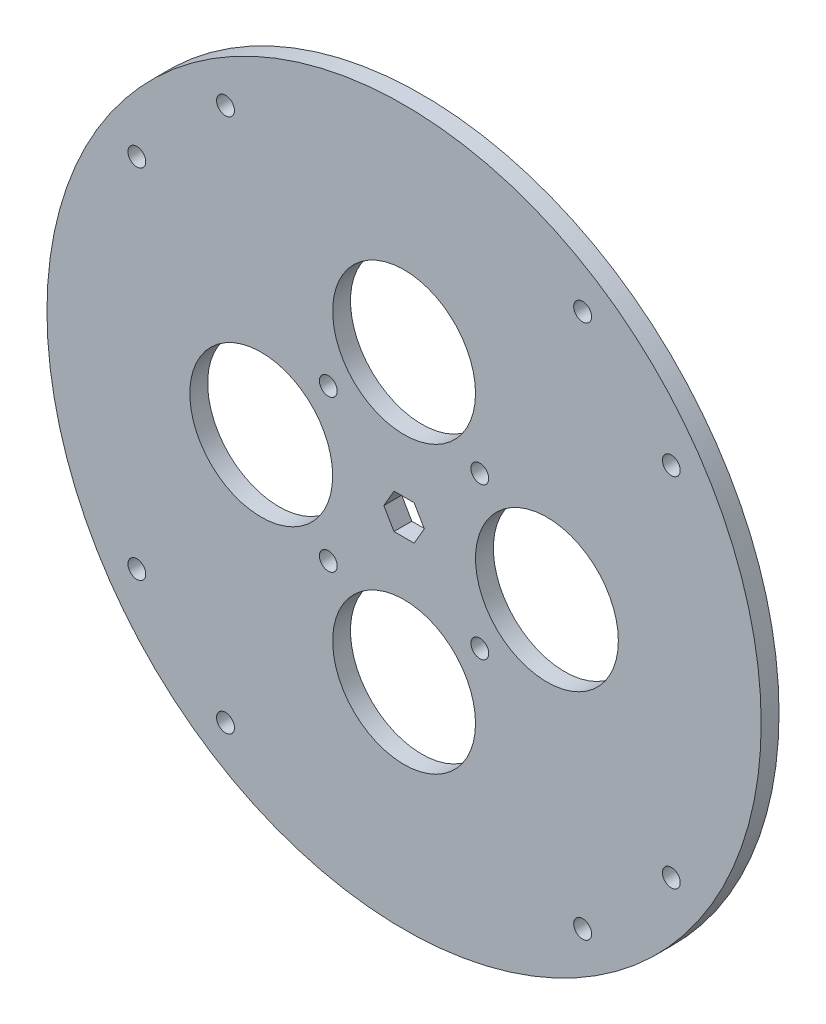
ISO-10303-21;
HEADER;
FILE_DESCRIPTION(('STEP AP214'),'2;1');
FILE_NAME('part.step','',(''),(''),'','','');
FILE_SCHEMA(('AUTOMOTIVE_DESIGN { 1 0 10303 214 1 1 1 1 }'));
ENDSEC;
DATA;
#1=APPLICATION_CONTEXT('core data for automotive mechanical design processes');
#2=APPLICATION_PROTOCOL_DEFINITION('international standard','automotive_design',2000,#1);
#3=PRODUCT_CONTEXT('',#1,'mechanical');
#4=PRODUCT('Part','Part','',(#3));
#5=PRODUCT_RELATED_PRODUCT_CATEGORY('part','',(#4));
#6=PRODUCT_DEFINITION_FORMATION('','',#4);
#7=PRODUCT_DEFINITION_CONTEXT('part definition',#1,'design');
#8=PRODUCT_DEFINITION('design','',#6,#7);
#9=PRODUCT_DEFINITION_SHAPE('','',#8);
#10=(LENGTH_UNIT() NAMED_UNIT(*) SI_UNIT(.MILLI.,.METRE.));
#11=(NAMED_UNIT(*) PLANE_ANGLE_UNIT() SI_UNIT($,.RADIAN.));
#12=(NAMED_UNIT(*) SI_UNIT($,.STERADIAN.) SOLID_ANGLE_UNIT());
#13=UNCERTAINTY_MEASURE_WITH_UNIT(LENGTH_MEASURE(1.E-05),#10,'distance_accuracy_value','');
#14=(GEOMETRIC_REPRESENTATION_CONTEXT(3) GLOBAL_UNCERTAINTY_ASSIGNED_CONTEXT((#13)) GLOBAL_UNIT_ASSIGNED_CONTEXT((#10,
#11,#12)) REPRESENTATION_CONTEXT('',''));
#15=CARTESIAN_POINT('',(0.,0.,0.));
#16=DIRECTION('',(0.,0.,1.));
#17=DIRECTION('',(1.,0.,0.));
#18=AXIS2_PLACEMENT_3D('',#15,#16,#17);
#19=CARTESIAN_POINT('',(0.,0.,6.35));
#20=DIRECTION('',(0.,0.,1.));
#21=DIRECTION('',(1.,0.,0.));
#22=AXIS2_PLACEMENT_3D('',#19,#20,#21);
#23=PLANE('',#22);
#24=CARTESIAN_POINT('',(63.5,95.0380976240581,6.35));
#25=DIRECTION('',(0.,0.,-1.));
#26=DIRECTION('',(-1.,0.,0.));
#27=AXIS2_PLACEMENT_3D('',#24,#25,#26);
#28=CIRCLE('',#27,3.175);
#29=CARTESIAN_POINT('',(60.325,95.0380976240581,6.35));
#30=VERTEX_POINT('',#29);
#31=EDGE_CURVE('E196',#30,#30,#28,.T.);
#32=ORIENTED_EDGE('',*,*,#31,.T.);
#33=EDGE_LOOP('',(#32));
#34=FACE_BOUND('',#33,.T.);
#35=CARTESIAN_POINT('',(-95.0380976240581,-63.5,6.35));
#36=DIRECTION('',(0.,0.,-1.));
#37=DIRECTION('',(-1.,0.,0.));
#38=AXIS2_PLACEMENT_3D('',#35,#36,#37);
#39=CIRCLE('',#38,3.175);
#40=CARTESIAN_POINT('',(-98.2130976240581,-63.5,6.35));
#41=VERTEX_POINT('',#40);
#42=EDGE_CURVE('E200',#41,#41,#39,.T.);
#43=ORIENTED_EDGE('',*,*,#42,.T.);
#44=EDGE_LOOP('',(#43));
#45=FACE_BOUND('',#44,.T.);
#46=CARTESIAN_POINT('',(-95.0380976240581,63.5,6.35));
#47=DIRECTION('',(0.,0.,-1.));
#48=DIRECTION('',(-1.,0.,0.));
#49=AXIS2_PLACEMENT_3D('',#46,#47,#48);
#50=CIRCLE('',#49,3.175);
#51=CARTESIAN_POINT('',(-98.2130976240581,63.5,6.35));
#52=VERTEX_POINT('',#51);
#53=EDGE_CURVE('E204',#52,#52,#50,.T.);
#54=ORIENTED_EDGE('',*,*,#53,.T.);
#55=EDGE_LOOP('',(#54));
#56=FACE_BOUND('',#55,.T.);
#57=CARTESIAN_POINT('',(63.5,-95.0380976240581,6.35));
#58=DIRECTION('',(0.,0.,-1.));
#59=DIRECTION('',(-1.,0.,0.));
#60=AXIS2_PLACEMENT_3D('',#57,#58,#59);
#61=CIRCLE('',#60,3.175);
#62=CARTESIAN_POINT('',(60.325,-95.0380976240581,6.35));
#63=VERTEX_POINT('',#62);
#64=EDGE_CURVE('E208',#63,#63,#61,.T.);
#65=ORIENTED_EDGE('',*,*,#64,.T.);
#66=EDGE_LOOP('',(#65));
#67=FACE_BOUND('',#66,.T.);
#68=CARTESIAN_POINT('',(-26.9407683632075,26.9407683632075,6.35));
#69=DIRECTION('',(0.,0.,-1.));
#70=DIRECTION('',(-1.,0.,0.));
#71=AXIS2_PLACEMENT_3D('',#68,#69,#70);
#72=CIRCLE('',#71,3.175);
#73=CARTESIAN_POINT('',(-30.1157683632075,26.9407683632075,6.35));
#74=VERTEX_POINT('',#73);
#75=EDGE_CURVE('E212',#74,#74,#72,.T.);
#76=ORIENTED_EDGE('',*,*,#75,.T.);
#77=EDGE_LOOP('',(#76));
#78=FACE_BOUND('',#77,.T.);
#79=CARTESIAN_POINT('',(-26.9407683632075,-26.9407683632075,6.35));
#80=DIRECTION('',(0.,0.,-1.));
#81=DIRECTION('',(-1.,0.,0.));
#82=AXIS2_PLACEMENT_3D('',#79,#80,#81);
#83=CIRCLE('',#82,3.175);
#84=CARTESIAN_POINT('',(-30.1157683632075,-26.9407683632075,6.35));
#85=VERTEX_POINT('',#84);
#86=EDGE_CURVE('E216',#85,#85,#83,.T.);
#87=ORIENTED_EDGE('',*,*,#86,.T.);
#88=EDGE_LOOP('',(#87));
#89=FACE_BOUND('',#88,.T.);
#90=CARTESIAN_POINT('',(26.9407683632075,-26.9407683632075,6.35));
#91=DIRECTION('',(0.,0.,-1.));
#92=DIRECTION('',(-1.,0.,0.));
#93=AXIS2_PLACEMENT_3D('',#90,#91,#92);
#94=CIRCLE('',#93,3.175);
#95=CARTESIAN_POINT('',(23.7657683632075,-26.9407683632075,6.35));
#96=VERTEX_POINT('',#95);
#97=EDGE_CURVE('E220',#96,#96,#94,.T.);
#98=ORIENTED_EDGE('',*,*,#97,.T.);
#99=EDGE_LOOP('',(#98));
#100=FACE_BOUND('',#99,.T.);
#101=CARTESIAN_POINT('',(-63.5,95.0380976240581,6.35));
#102=DIRECTION('',(0.,0.,-1.));
#103=DIRECTION('',(-1.,0.,0.));
#104=AXIS2_PLACEMENT_3D('',#101,#102,#103);
#105=CIRCLE('',#104,3.175);
#106=CARTESIAN_POINT('',(-66.675,95.0380976240581,6.35));
#107=VERTEX_POINT('',#106);
#108=EDGE_CURVE('E224',#107,#107,#105,.T.);
#109=ORIENTED_EDGE('',*,*,#108,.T.);
#110=EDGE_LOOP('',(#109));
#111=FACE_BOUND('',#110,.T.);
#112=CARTESIAN_POINT('',(95.0380976240581,-63.5,6.35));
#113=DIRECTION('',(0.,0.,-1.));
#114=DIRECTION('',(-1.,0.,0.));
#115=AXIS2_PLACEMENT_3D('',#112,#113,#114);
#116=CIRCLE('',#115,3.175);
#117=CARTESIAN_POINT('',(91.8630976240581,-63.5,6.35));
#118=VERTEX_POINT('',#117);
#119=EDGE_CURVE('E228',#118,#118,#116,.T.);
#120=ORIENTED_EDGE('',*,*,#119,.T.);
#121=EDGE_LOOP('',(#120));
#122=FACE_BOUND('',#121,.T.);
#123=CARTESIAN_POINT('',(95.0380976240581,63.5,6.35));
#124=DIRECTION('',(0.,0.,-1.));
#125=DIRECTION('',(-1.,0.,0.));
#126=AXIS2_PLACEMENT_3D('',#123,#124,#125);
#127=CIRCLE('',#126,3.17499999999997);
#128=CARTESIAN_POINT('',(91.8630976240582,63.5,6.35));
#129=VERTEX_POINT('',#128);
#130=EDGE_CURVE('E232',#129,#129,#127,.T.);
#131=ORIENTED_EDGE('',*,*,#130,.T.);
#132=EDGE_LOOP('',(#131));
#133=FACE_BOUND('',#132,.T.);
#134=CARTESIAN_POINT('',(-63.5,-95.0380976240581,6.35));
#135=DIRECTION('',(0.,0.,-1.));
#136=DIRECTION('',(-1.,0.,0.));
#137=AXIS2_PLACEMENT_3D('',#134,#135,#136);
#138=CIRCLE('',#137,3.175);
#139=CARTESIAN_POINT('',(-66.675,-95.0380976240581,6.35));
#140=VERTEX_POINT('',#139);
#141=EDGE_CURVE('E236',#140,#140,#138,.T.);
#142=ORIENTED_EDGE('',*,*,#141,.T.);
#143=EDGE_LOOP('',(#142));
#144=FACE_BOUND('',#143,.T.);
#145=CARTESIAN_POINT('',(26.9407683632075,26.9407683632075,6.35));
#146=DIRECTION('',(0.,0.,-1.));
#147=DIRECTION('',(-1.,0.,0.));
#148=AXIS2_PLACEMENT_3D('',#145,#146,#147);
#149=CIRCLE('',#148,3.175);
#150=CARTESIAN_POINT('',(23.7657683632075,26.9407683632075,6.35));
#151=VERTEX_POINT('',#150);
#152=EDGE_CURVE('E240',#151,#151,#149,.T.);
#153=ORIENTED_EDGE('',*,*,#152,.T.);
#154=EDGE_LOOP('',(#153));
#155=FACE_BOUND('',#154,.T.);
#156=CARTESIAN_POINT('',(0.,-50.8,6.35));
#157=DIRECTION('',(0.,0.,1.));
#158=DIRECTION('',(1.,0.,0.));
#159=AXIS2_PLACEMENT_3D('',#156,#157,#158);
#160=CIRCLE('',#159,25.4);
#161=CARTESIAN_POINT('',(25.4,-50.8,6.35));
#162=VERTEX_POINT('',#161);
#163=EDGE_CURVE('E243',#162,#162,#160,.T.);
#164=ORIENTED_EDGE('',*,*,#163,.F.);
#165=EDGE_LOOP('',(#164));
#166=FACE_BOUND('',#165,.T.);
#167=DIRECTION('',(-0.5,0.866025403784438,0.));
#168=VECTOR('',#167,1.);
#169=CARTESIAN_POINT('',(7.18570145033408,0.,6.35));
#170=LINE('',#169,#168);
#171=CARTESIAN_POINT('',(7.18570145033408,0.,6.35));
#172=VERTEX_POINT('',#171);
#173=CARTESIAN_POINT('',(3.59285072516704,6.223,6.35));
#174=VERTEX_POINT('',#173);
#175=EDGE_CURVE('E102',#172,#174,#170,.T.);
#176=ORIENTED_EDGE('',*,*,#175,.F.);
#177=DIRECTION('',(0.5,0.866025403784439,0.));
#178=VECTOR('',#177,1.);
#179=CARTESIAN_POINT('',(3.59285072516704,-6.223,6.35));
#180=LINE('',#179,#178);
#181=CARTESIAN_POINT('',(3.59285072516704,-6.223,6.35));
#182=VERTEX_POINT('',#181);
#183=EDGE_CURVE('E93',#182,#172,#180,.T.);
#184=ORIENTED_EDGE('',*,*,#183,.F.);
#185=DIRECTION('',(1.,0.,0.));
#186=VECTOR('',#185,1.);
#187=CARTESIAN_POINT('',(-3.59285072516704,-6.223,6.35));
#188=LINE('',#187,#186);
#189=CARTESIAN_POINT('',(-3.59285072516704,-6.223,6.35));
#190=VERTEX_POINT('',#189);
#191=EDGE_CURVE('E130',#190,#182,#188,.T.);
#192=ORIENTED_EDGE('',*,*,#191,.F.);
#193=DIRECTION('',(0.5,-0.866025403784439,0.));
#194=VECTOR('',#193,1.);
#195=CARTESIAN_POINT('',(-7.18570145033408,0.,6.35));
#196=LINE('',#195,#194);
#197=CARTESIAN_POINT('',(-7.18570145033408,0.,6.35));
#198=VERTEX_POINT('',#197);
#199=EDGE_CURVE('E127',#198,#190,#196,.T.);
#200=ORIENTED_EDGE('',*,*,#199,.F.);
#201=DIRECTION('',(-0.5,-0.866025403784439,0.));
#202=VECTOR('',#201,1.);
#203=CARTESIAN_POINT('',(-3.59285072516704,6.223,6.35));
#204=LINE('',#203,#202);
#205=CARTESIAN_POINT('',(-3.59285072516704,6.223,6.35));
#206=VERTEX_POINT('',#205);
#207=EDGE_CURVE('E121',#206,#198,#204,.T.);
#208=ORIENTED_EDGE('',*,*,#207,.F.);
#209=DIRECTION('',(-1.,0.,0.));
#210=VECTOR('',#209,1.);
#211=CARTESIAN_POINT('',(3.59285072516704,6.223,6.35));
#212=LINE('',#211,#210);
#213=EDGE_CURVE('E117',#174,#206,#212,.T.);
#214=ORIENTED_EDGE('',*,*,#213,.F.);
#215=EDGE_LOOP('',(#176,#184,#192,#200,#208,#214));
#216=FACE_BOUND('',#215,.T.);
#217=CARTESIAN_POINT('',(0.,50.8,6.35));
#218=DIRECTION('',(0.,0.,1.));
#219=DIRECTION('',(1.,0.,0.));
#220=AXIS2_PLACEMENT_3D('',#217,#218,#219);
#221=CIRCLE('',#220,25.4);
#222=CARTESIAN_POINT('',(25.4,50.8,6.35));
#223=VERTEX_POINT('',#222);
#224=EDGE_CURVE('E165',#223,#223,#221,.T.);
#225=ORIENTED_EDGE('',*,*,#224,.F.);
#226=EDGE_LOOP('',(#225));
#227=FACE_BOUND('',#226,.T.);
#228=CARTESIAN_POINT('',(0.,0.,6.35));
#229=DIRECTION('',(0.,0.,1.));
#230=DIRECTION('',(1.,0.,0.));
#231=AXIS2_PLACEMENT_3D('',#228,#229,#230);
#232=CIRCLE('',#231,127.);
#233=CARTESIAN_POINT('',(127.,0.,6.35));
#234=VERTEX_POINT('',#233);
#235=EDGE_CURVE('E11',#234,#234,#232,.T.);
#236=ORIENTED_EDGE('',*,*,#235,.T.);
#237=EDGE_LOOP('',(#236));
#238=FACE_BOUND('',#237,.T.);
#239=CARTESIAN_POINT('',(50.8,0.,6.35));
#240=DIRECTION('',(0.,0.,1.));
#241=DIRECTION('',(1.,0.,0.));
#242=AXIS2_PLACEMENT_3D('',#239,#240,#241);
#243=CIRCLE('',#242,25.4);
#244=CARTESIAN_POINT('',(76.2,0.,6.35));
#245=VERTEX_POINT('',#244);
#246=EDGE_CURVE('E135',#245,#245,#243,.T.);
#247=ORIENTED_EDGE('',*,*,#246,.F.);
#248=EDGE_LOOP('',(#247));
#249=FACE_BOUND('',#248,.T.);
#250=CARTESIAN_POINT('',(-50.8,0.,6.35));
#251=DIRECTION('',(0.,0.,1.));
#252=DIRECTION('',(1.,0.,0.));
#253=AXIS2_PLACEMENT_3D('',#250,#251,#252);
#254=CIRCLE('',#253,25.4);
#255=CARTESIAN_POINT('',(-25.4,0.,6.35));
#256=VERTEX_POINT('',#255);
#257=EDGE_CURVE('E253',#256,#256,#254,.T.);
#258=ORIENTED_EDGE('',*,*,#257,.F.);
#259=EDGE_LOOP('',(#258));
#260=FACE_BOUND('',#259,.T.);
#261=ADVANCED_FACE('F39',(#34,#45,#56,#67,#78,#89,#100,#111,#122,#133,#144,#155,#166,#216,#227,
#238,#249,#260),#23,.T.);
#262=CARTESIAN_POINT('',(0.,0.,0.));
#263=DIRECTION('',(0.,0.,1.));
#264=DIRECTION('',(1.,0.,0.));
#265=AXIS2_PLACEMENT_3D('',#262,#263,#264);
#266=PLANE('',#265);
#267=CARTESIAN_POINT('',(63.5,95.0380976240581,0.));
#268=DIRECTION('',(0.,0.,-1.));
#269=DIRECTION('',(-1.,0.,0.));
#270=AXIS2_PLACEMENT_3D('',#267,#268,#269);
#271=CIRCLE('',#270,3.175);
#272=CARTESIAN_POINT('',(60.325,95.0380976240581,0.));
#273=VERTEX_POINT('',#272);
#274=EDGE_CURVE('E310',#273,#273,#271,.T.);
#275=ORIENTED_EDGE('',*,*,#274,.F.);
#276=EDGE_LOOP('',(#275));
#277=FACE_BOUND('',#276,.T.);
#278=CARTESIAN_POINT('',(-95.0380976240581,-63.5,0.));
#279=DIRECTION('',(0.,0.,-1.));
#280=DIRECTION('',(-1.,0.,0.));
#281=AXIS2_PLACEMENT_3D('',#278,#279,#280);
#282=CIRCLE('',#281,3.175);
#283=CARTESIAN_POINT('',(-98.2130976240581,-63.5,0.));
#284=VERTEX_POINT('',#283);
#285=EDGE_CURVE('E304',#284,#284,#282,.T.);
#286=ORIENTED_EDGE('',*,*,#285,.F.);
#287=EDGE_LOOP('',(#286));
#288=FACE_BOUND('',#287,.T.);
#289=CARTESIAN_POINT('',(-95.0380976240581,63.5,0.));
#290=DIRECTION('',(0.,0.,-1.));
#291=DIRECTION('',(-1.,0.,0.));
#292=AXIS2_PLACEMENT_3D('',#289,#290,#291);
#293=CIRCLE('',#292,3.175);
#294=CARTESIAN_POINT('',(-98.2130976240581,63.5,0.));
#295=VERTEX_POINT('',#294);
#296=EDGE_CURVE('E322',#295,#295,#293,.T.);
#297=ORIENTED_EDGE('',*,*,#296,.F.);
#298=EDGE_LOOP('',(#297));
#299=FACE_BOUND('',#298,.T.);
#300=CARTESIAN_POINT('',(63.5,-95.0380976240581,0.));
#301=DIRECTION('',(0.,0.,-1.));
#302=DIRECTION('',(-1.,0.,0.));
#303=AXIS2_PLACEMENT_3D('',#300,#301,#302);
#304=CIRCLE('',#303,3.175);
#305=CARTESIAN_POINT('',(60.325,-95.0380976240581,0.));
#306=VERTEX_POINT('',#305);
#307=EDGE_CURVE('E316',#306,#306,#304,.T.);
#308=ORIENTED_EDGE('',*,*,#307,.F.);
#309=EDGE_LOOP('',(#308));
#310=FACE_BOUND('',#309,.T.);
#311=CARTESIAN_POINT('',(-26.9407683632075,26.9407683632075,0.));
#312=DIRECTION('',(0.,0.,-1.));
#313=DIRECTION('',(-1.,0.,0.));
#314=AXIS2_PLACEMENT_3D('',#311,#312,#313);
#315=CIRCLE('',#314,3.175);
#316=CARTESIAN_POINT('',(-30.1157683632075,26.9407683632075,0.));
#317=VERTEX_POINT('',#316);
#318=EDGE_CURVE('E286',#317,#317,#315,.T.);
#319=ORIENTED_EDGE('',*,*,#318,.F.);
#320=EDGE_LOOP('',(#319));
#321=FACE_BOUND('',#320,.T.);
#322=CARTESIAN_POINT('',(-26.9407683632075,-26.9407683632075,0.));
#323=DIRECTION('',(0.,0.,-1.));
#324=DIRECTION('',(-1.,0.,0.));
#325=AXIS2_PLACEMENT_3D('',#322,#323,#324);
#326=CIRCLE('',#325,3.175);
#327=CARTESIAN_POINT('',(-30.1157683632075,-26.9407683632075,0.));
#328=VERTEX_POINT('',#327);
#329=EDGE_CURVE('E280',#328,#328,#326,.T.);
#330=ORIENTED_EDGE('',*,*,#329,.F.);
#331=EDGE_LOOP('',(#330));
#332=FACE_BOUND('',#331,.T.);
#333=CARTESIAN_POINT('',(26.9407683632075,-26.9407683632075,0.));
#334=DIRECTION('',(0.,0.,-1.));
#335=DIRECTION('',(-1.,0.,0.));
#336=AXIS2_PLACEMENT_3D('',#333,#334,#335);
#337=CIRCLE('',#336,3.175);
#338=CARTESIAN_POINT('',(23.7657683632075,-26.9407683632075,0.));
#339=VERTEX_POINT('',#338);
#340=EDGE_CURVE('E298',#339,#339,#337,.T.);
#341=ORIENTED_EDGE('',*,*,#340,.F.);
#342=EDGE_LOOP('',(#341));
#343=FACE_BOUND('',#342,.T.);
#344=CARTESIAN_POINT('',(-63.5,95.0380976240581,0.));
#345=DIRECTION('',(0.,0.,-1.));
#346=DIRECTION('',(-1.,0.,0.));
#347=AXIS2_PLACEMENT_3D('',#344,#345,#346);
#348=CIRCLE('',#347,3.175);
#349=CARTESIAN_POINT('',(-66.675,95.0380976240581,0.));
#350=VERTEX_POINT('',#349);
#351=EDGE_CURVE('E292',#350,#350,#348,.T.);
#352=ORIENTED_EDGE('',*,*,#351,.F.);
#353=EDGE_LOOP('',(#352));
#354=FACE_BOUND('',#353,.T.);
#355=CARTESIAN_POINT('',(95.0380976240581,-63.5,0.));
#356=DIRECTION('',(0.,0.,-1.));
#357=DIRECTION('',(-1.,0.,0.));
#358=AXIS2_PLACEMENT_3D('',#355,#356,#357);
#359=CIRCLE('',#358,3.175);
#360=CARTESIAN_POINT('',(91.8630976240581,-63.5,0.));
#361=VERTEX_POINT('',#360);
#362=EDGE_CURVE('E340',#361,#361,#359,.T.);
#363=ORIENTED_EDGE('',*,*,#362,.F.);
#364=EDGE_LOOP('',(#363));
#365=FACE_BOUND('',#364,.T.);
#366=CARTESIAN_POINT('',(95.0380976240581,63.5,0.));
#367=DIRECTION('',(0.,0.,-1.));
#368=DIRECTION('',(-1.,0.,0.));
#369=AXIS2_PLACEMENT_3D('',#366,#367,#368);
#370=CIRCLE('',#369,3.17499999999997);
#371=CARTESIAN_POINT('',(91.8630976240582,63.5,0.));
#372=VERTEX_POINT('',#371);
#373=EDGE_CURVE('E328',#372,#372,#370,.T.);
#374=ORIENTED_EDGE('',*,*,#373,.F.);
#375=EDGE_LOOP('',(#374));
#376=FACE_BOUND('',#375,.T.);
#377=CARTESIAN_POINT('',(-63.5,-95.0380976240581,0.));
#378=DIRECTION('',(0.,0.,-1.));
#379=DIRECTION('',(-1.,0.,0.));
#380=AXIS2_PLACEMENT_3D('',#377,#378,#379);
#381=CIRCLE('',#380,3.175);
#382=CARTESIAN_POINT('',(-66.675,-95.0380976240581,0.));
#383=VERTEX_POINT('',#382);
#384=EDGE_CURVE('E334',#383,#383,#381,.T.);
#385=ORIENTED_EDGE('',*,*,#384,.F.);
#386=EDGE_LOOP('',(#385));
#387=FACE_BOUND('',#386,.T.);
#388=CARTESIAN_POINT('',(26.9407683632075,26.9407683632075,0.));
#389=DIRECTION('',(0.,0.,-1.));
#390=DIRECTION('',(-1.,0.,0.));
#391=AXIS2_PLACEMENT_3D('',#388,#389,#390);
#392=CIRCLE('',#391,3.175);
#393=CARTESIAN_POINT('',(23.7657683632075,26.9407683632075,0.));
#394=VERTEX_POINT('',#393);
#395=EDGE_CURVE('E274',#394,#394,#392,.T.);
#396=ORIENTED_EDGE('',*,*,#395,.F.);
#397=EDGE_LOOP('',(#396));
#398=FACE_BOUND('',#397,.T.);
#399=CARTESIAN_POINT('',(0.,50.8,0.));
#400=DIRECTION('',(0.,0.,1.));
#401=DIRECTION('',(1.,0.,0.));
#402=AXIS2_PLACEMENT_3D('',#399,#400,#401);
#403=CIRCLE('',#402,25.4);
#404=CARTESIAN_POINT('',(25.4,50.8,0.));
#405=VERTEX_POINT('',#404);
#406=EDGE_CURVE('E111',#405,#405,#403,.T.);
#407=ORIENTED_EDGE('',*,*,#406,.T.);
#408=EDGE_LOOP('',(#407));
#409=FACE_BOUND('',#408,.T.);
#410=CARTESIAN_POINT('',(0.,0.,0.));
#411=DIRECTION('',(0.,0.,1.));
#412=DIRECTION('',(1.,0.,0.));
#413=AXIS2_PLACEMENT_3D('',#410,#411,#412);
#414=CIRCLE('',#413,127.);
#415=CARTESIAN_POINT('',(127.,0.,0.));
#416=VERTEX_POINT('',#415);
#417=EDGE_CURVE('E43',#416,#416,#414,.T.);
#418=ORIENTED_EDGE('',*,*,#417,.F.);
#419=EDGE_LOOP('',(#418));
#420=FACE_BOUND('',#419,.T.);
#421=DIRECTION('',(0.5,0.866025403784439,0.));
#422=VECTOR('',#421,1.);
#423=CARTESIAN_POINT('',(3.59285072516704,-6.223,0.));
#424=LINE('',#423,#422);
#425=CARTESIAN_POINT('',(3.59285072516704,-6.223,0.));
#426=VERTEX_POINT('',#425);
#427=CARTESIAN_POINT('',(7.18570145033408,0.,0.));
#428=VERTEX_POINT('',#427);
#429=EDGE_CURVE('E63',#426,#428,#424,.T.);
#430=ORIENTED_EDGE('',*,*,#429,.T.);
#431=DIRECTION('',(-0.5,0.866025403784438,0.));
#432=VECTOR('',#431,1.);
#433=CARTESIAN_POINT('',(7.18570145033408,0.,0.));
#434=LINE('',#433,#432);
#435=CARTESIAN_POINT('',(3.59285072516704,6.223,0.));
#436=VERTEX_POINT('',#435);
#437=EDGE_CURVE('E109',#428,#436,#434,.T.);
#438=ORIENTED_EDGE('',*,*,#437,.T.);
#439=DIRECTION('',(-1.,0.,0.));
#440=VECTOR('',#439,1.);
#441=CARTESIAN_POINT('',(3.59285072516704,6.223,0.));
#442=LINE('',#441,#440);
#443=CARTESIAN_POINT('',(-3.59285072516704,6.223,0.));
#444=VERTEX_POINT('',#443);
#445=EDGE_CURVE('E138',#436,#444,#442,.T.);
#446=ORIENTED_EDGE('',*,*,#445,.T.);
#447=DIRECTION('',(-0.5,-0.866025403784439,0.));
#448=VECTOR('',#447,1.);
#449=CARTESIAN_POINT('',(-3.59285072516704,6.223,0.));
#450=LINE('',#449,#448);
#451=CARTESIAN_POINT('',(-7.18570145033408,0.,0.));
#452=VERTEX_POINT('',#451);
#453=EDGE_CURVE('E142',#444,#452,#450,.T.);
#454=ORIENTED_EDGE('',*,*,#453,.T.);
#455=DIRECTION('',(0.5,-0.866025403784439,0.));
#456=VECTOR('',#455,1.);
#457=CARTESIAN_POINT('',(-7.18570145033408,0.,0.));
#458=LINE('',#457,#456);
#459=CARTESIAN_POINT('',(-3.59285072516704,-6.223,0.));
#460=VERTEX_POINT('',#459);
#461=EDGE_CURVE('E146',#452,#460,#458,.T.);
#462=ORIENTED_EDGE('',*,*,#461,.T.);
#463=DIRECTION('',(1.,0.,0.));
#464=VECTOR('',#463,1.);
#465=CARTESIAN_POINT('',(-3.59285072516704,-6.223,0.));
#466=LINE('',#465,#464);
#467=EDGE_CURVE('E103',#460,#426,#466,.T.);
#468=ORIENTED_EDGE('',*,*,#467,.T.);
#469=EDGE_LOOP('',(#430,#438,#446,#454,#462,#468));
#470=FACE_BOUND('',#469,.T.);
#471=CARTESIAN_POINT('',(50.8,0.,0.));
#472=DIRECTION('',(0.,0.,1.));
#473=DIRECTION('',(1.,0.,0.));
#474=AXIS2_PLACEMENT_3D('',#471,#472,#473);
#475=CIRCLE('',#474,25.4);
#476=CARTESIAN_POINT('',(76.2,0.,0.));
#477=VERTEX_POINT('',#476);
#478=EDGE_CURVE('E246',#477,#477,#475,.T.);
#479=ORIENTED_EDGE('',*,*,#478,.T.);
#480=EDGE_LOOP('',(#479));
#481=FACE_BOUND('',#480,.T.);
#482=CARTESIAN_POINT('',(0.,-50.8,0.));
#483=DIRECTION('',(0.,0.,1.));
#484=DIRECTION('',(1.,0.,0.));
#485=AXIS2_PLACEMENT_3D('',#482,#483,#484);
#486=CIRCLE('',#485,25.4);
#487=CARTESIAN_POINT('',(25.4,-50.8,0.));
#488=VERTEX_POINT('',#487);
#489=EDGE_CURVE('E247',#488,#488,#486,.T.);
#490=ORIENTED_EDGE('',*,*,#489,.T.);
#491=EDGE_LOOP('',(#490));
#492=FACE_BOUND('',#491,.T.);
#493=CARTESIAN_POINT('',(-50.8,0.,0.));
#494=DIRECTION('',(0.,0.,1.));
#495=DIRECTION('',(1.,0.,0.));
#496=AXIS2_PLACEMENT_3D('',#493,#494,#495);
#497=CIRCLE('',#496,25.4);
#498=CARTESIAN_POINT('',(-25.4,0.,0.));
#499=VERTEX_POINT('',#498);
#500=EDGE_CURVE('E256',#499,#499,#497,.T.);
#501=ORIENTED_EDGE('',*,*,#500,.T.);
#502=EDGE_LOOP('',(#501));
#503=FACE_BOUND('',#502,.T.);
#504=ADVANCED_FACE('F173',(#277,#288,#299,#310,#321,#332,#343,#354,#365,#376,#387,#398,#409,
#420,#470,#481,#492,#503),#266,.F.);
#505=CARTESIAN_POINT('',(0.,0.,6.35));
#506=DIRECTION('',(0.,0.,-1.));
#507=DIRECTION('',(-1.,0.,0.));
#508=AXIS2_PLACEMENT_3D('',#505,#506,#507);
#509=CYLINDRICAL_SURFACE('',#508,127.);
#510=ORIENTED_EDGE('',*,*,#235,.F.);
#511=EDGE_LOOP('',(#510));
#512=FACE_BOUND('',#511,.T.);
#513=ORIENTED_EDGE('',*,*,#417,.T.);
#514=EDGE_LOOP('',(#513));
#515=FACE_BOUND('',#514,.T.);
#516=ADVANCED_FACE('F41',(#512,#515),#509,.T.);
#517=CARTESIAN_POINT('',(0.,50.8,6.35));
#518=DIRECTION('',(0.,0.,-1.));
#519=DIRECTION('',(-1.,0.,0.));
#520=AXIS2_PLACEMENT_3D('',#517,#518,#519);
#521=CYLINDRICAL_SURFACE('',#520,25.4);
#522=ORIENTED_EDGE('',*,*,#224,.T.);
#523=EDGE_LOOP('',(#522));
#524=FACE_BOUND('',#523,.T.);
#525=ORIENTED_EDGE('',*,*,#406,.F.);
#526=EDGE_LOOP('',(#525));
#527=FACE_BOUND('',#526,.T.);
#528=ADVANCED_FACE('F176',(#524,#527),#521,.F.);
#529=CARTESIAN_POINT('',(3.59285072516704,-6.223,6.35));
#530=DIRECTION('',(-0.866025403784439,0.5,0.));
#531=DIRECTION('',(-0.5,-0.866025403784439,0.));
#532=AXIS2_PLACEMENT_3D('',#529,#530,#531);
#533=PLANE('',#532);
#534=ORIENTED_EDGE('',*,*,#429,.F.);
#535=DIRECTION('',(0.,0.,-1.));
#536=VECTOR('',#535,1.);
#537=CARTESIAN_POINT('',(3.59285072516704,-6.223,6.35));
#538=LINE('',#537,#536);
#539=EDGE_CURVE('E97',#182,#426,#538,.T.);
#540=ORIENTED_EDGE('',*,*,#539,.F.);
#541=ORIENTED_EDGE('',*,*,#183,.T.);
#542=DIRECTION('',(0.,0.,-1.));
#543=VECTOR('',#542,1.);
#544=CARTESIAN_POINT('',(7.18570145033408,0.,6.35));
#545=LINE('',#544,#543);
#546=EDGE_CURVE('E96',#172,#428,#545,.T.);
#547=ORIENTED_EDGE('',*,*,#546,.T.);
#548=EDGE_LOOP('',(#534,#540,#541,#547));
#549=FACE_BOUND('',#548,.T.);
#550=ADVANCED_FACE('F95',(#549),#533,.T.);
#551=CARTESIAN_POINT('',(7.18570145033408,0.,6.35));
#552=DIRECTION('',(-0.866025403784439,-0.5,0.));
#553=DIRECTION('',(0.5,-0.866025403784439,0.));
#554=AXIS2_PLACEMENT_3D('',#551,#552,#553);
#555=PLANE('',#554);
#556=ORIENTED_EDGE('',*,*,#437,.F.);
#557=ORIENTED_EDGE('',*,*,#546,.F.);
#558=ORIENTED_EDGE('',*,*,#175,.T.);
#559=DIRECTION('',(0.,0.,-1.));
#560=VECTOR('',#559,1.);
#561=CARTESIAN_POINT('',(3.59285072516704,6.223,6.35));
#562=LINE('',#561,#560);
#563=EDGE_CURVE('E112',#174,#436,#562,.T.);
#564=ORIENTED_EDGE('',*,*,#563,.T.);
#565=EDGE_LOOP('',(#556,#557,#558,#564));
#566=FACE_BOUND('',#565,.T.);
#567=ADVANCED_FACE('F106',(#566),#555,.T.);
#568=CARTESIAN_POINT('',(3.59285072516704,6.223,6.35));
#569=DIRECTION('',(0.,-1.,0.));
#570=DIRECTION('',(0.,0.,-1.));
#571=AXIS2_PLACEMENT_3D('',#568,#569,#570);
#572=PLANE('',#571);
#573=ORIENTED_EDGE('',*,*,#445,.F.);
#574=ORIENTED_EDGE('',*,*,#563,.F.);
#575=ORIENTED_EDGE('',*,*,#213,.T.);
#576=DIRECTION('',(0.,0.,-1.));
#577=VECTOR('',#576,1.);
#578=CARTESIAN_POINT('',(-3.59285072516704,6.223,6.35));
#579=LINE('',#578,#577);
#580=EDGE_CURVE('E160',#206,#444,#579,.T.);
#581=ORIENTED_EDGE('',*,*,#580,.T.);
#582=EDGE_LOOP('',(#573,#574,#575,#581));
#583=FACE_BOUND('',#582,.T.);
#584=ADVANCED_FACE('F389',(#583),#572,.T.);
#585=CARTESIAN_POINT('',(-3.59285072516704,6.223,6.35));
#586=DIRECTION('',(0.866025403784439,-0.5,0.));
#587=DIRECTION('',(0.5,0.866025403784439,0.));
#588=AXIS2_PLACEMENT_3D('',#585,#586,#587);
#589=PLANE('',#588);
#590=ORIENTED_EDGE('',*,*,#453,.F.);
#591=ORIENTED_EDGE('',*,*,#580,.F.);
#592=ORIENTED_EDGE('',*,*,#207,.T.);
#593=DIRECTION('',(0.,0.,-1.));
#594=VECTOR('',#593,1.);
#595=CARTESIAN_POINT('',(-7.18570145033408,0.,6.35));
#596=LINE('',#595,#594);
#597=EDGE_CURVE('E157',#198,#452,#596,.T.);
#598=ORIENTED_EDGE('',*,*,#597,.T.);
#599=EDGE_LOOP('',(#590,#591,#592,#598));
#600=FACE_BOUND('',#599,.T.);
#601=ADVANCED_FACE('F385',(#600),#589,.T.);
#602=CARTESIAN_POINT('',(-7.18570145033408,0.,6.35));
#603=DIRECTION('',(0.866025403784438,0.5,0.));
#604=DIRECTION('',(-0.5,0.866025403784439,0.));
#605=AXIS2_PLACEMENT_3D('',#602,#603,#604);
#606=PLANE('',#605);
#607=ORIENTED_EDGE('',*,*,#461,.F.);
#608=ORIENTED_EDGE('',*,*,#597,.F.);
#609=ORIENTED_EDGE('',*,*,#199,.T.);
#610=DIRECTION('',(0.,0.,-1.));
#611=VECTOR('',#610,1.);
#612=CARTESIAN_POINT('',(-3.59285072516704,-6.223,6.35));
#613=LINE('',#612,#611);
#614=EDGE_CURVE('E55',#190,#460,#613,.T.);
#615=ORIENTED_EDGE('',*,*,#614,.T.);
#616=EDGE_LOOP('',(#607,#608,#609,#615));
#617=FACE_BOUND('',#616,.T.);
#618=ADVANCED_FACE('F382',(#617),#606,.T.);
#619=CARTESIAN_POINT('',(-3.59285072516704,-6.223,6.35));
#620=DIRECTION('',(0.,1.,0.));
#621=DIRECTION('',(-1.,0.,0.));
#622=AXIS2_PLACEMENT_3D('',#619,#620,#621);
#623=PLANE('',#622);
#624=ORIENTED_EDGE('',*,*,#467,.F.);
#625=ORIENTED_EDGE('',*,*,#614,.F.);
#626=ORIENTED_EDGE('',*,*,#191,.T.);
#627=ORIENTED_EDGE('',*,*,#539,.T.);
#628=EDGE_LOOP('',(#624,#625,#626,#627));
#629=FACE_BOUND('',#628,.T.);
#630=ADVANCED_FACE('F379',(#629),#623,.T.);
#631=CARTESIAN_POINT('',(50.8,0.,6.35));
#632=DIRECTION('',(0.,0.,-1.));
#633=DIRECTION('',(-1.,0.,0.));
#634=AXIS2_PLACEMENT_3D('',#631,#632,#633);
#635=CYLINDRICAL_SURFACE('',#634,25.4);
#636=ORIENTED_EDGE('',*,*,#246,.T.);
#637=EDGE_LOOP('',(#636));
#638=FACE_BOUND('',#637,.T.);
#639=ORIENTED_EDGE('',*,*,#478,.F.);
#640=EDGE_LOOP('',(#639));
#641=FACE_BOUND('',#640,.T.);
#642=ADVANCED_FACE('F263',(#638,#641),#635,.F.);
#643=CARTESIAN_POINT('',(0.,-50.8,6.35));
#644=DIRECTION('',(0.,0.,-1.));
#645=DIRECTION('',(-1.,0.,0.));
#646=AXIS2_PLACEMENT_3D('',#643,#644,#645);
#647=CYLINDRICAL_SURFACE('',#646,25.4);
#648=ORIENTED_EDGE('',*,*,#163,.T.);
#649=EDGE_LOOP('',(#648));
#650=FACE_BOUND('',#649,.T.);
#651=ORIENTED_EDGE('',*,*,#489,.F.);
#652=EDGE_LOOP('',(#651));
#653=FACE_BOUND('',#652,.T.);
#654=ADVANCED_FACE('F369',(#650,#653),#647,.F.);
#655=CARTESIAN_POINT('',(-50.8,0.,6.35));
#656=DIRECTION('',(0.,0.,-1.));
#657=DIRECTION('',(-1.,0.,0.));
#658=AXIS2_PLACEMENT_3D('',#655,#656,#657);
#659=CYLINDRICAL_SURFACE('',#658,25.4);
#660=ORIENTED_EDGE('',*,*,#257,.T.);
#661=EDGE_LOOP('',(#660));
#662=FACE_BOUND('',#661,.T.);
#663=ORIENTED_EDGE('',*,*,#500,.F.);
#664=EDGE_LOOP('',(#663));
#665=FACE_BOUND('',#664,.T.);
#666=ADVANCED_FACE('F359',(#662,#665),#659,.F.);
#667=CARTESIAN_POINT('',(26.9407683632075,26.9407683632075,6.35));
#668=DIRECTION('',(0.,0.,-1.));
#669=DIRECTION('',(-1.,0.,0.));
#670=AXIS2_PLACEMENT_3D('',#667,#668,#669);
#671=CYLINDRICAL_SURFACE('',#670,3.175);
#672=ORIENTED_EDGE('',*,*,#152,.F.);
#673=EDGE_LOOP('',(#672));
#674=FACE_BOUND('',#673,.T.);
#675=ORIENTED_EDGE('',*,*,#395,.T.);
#676=EDGE_LOOP('',(#675));
#677=FACE_BOUND('',#676,.T.);
#678=ADVANCED_FACE('F356',(#674,#677),#671,.F.);
#679=CARTESIAN_POINT('',(-63.5,-95.0380976240581,6.35));
#680=DIRECTION('',(0.,0.,-1.));
#681=DIRECTION('',(-1.,0.,0.));
#682=AXIS2_PLACEMENT_3D('',#679,#680,#681);
#683=CYLINDRICAL_SURFACE('',#682,3.175);
#684=ORIENTED_EDGE('',*,*,#141,.F.);
#685=EDGE_LOOP('',(#684));
#686=FACE_BOUND('',#685,.T.);
#687=ORIENTED_EDGE('',*,*,#384,.T.);
#688=EDGE_LOOP('',(#687));
#689=FACE_BOUND('',#688,.T.);
#690=ADVANCED_FACE('F358',(#686,#689),#683,.F.);
#691=CARTESIAN_POINT('',(95.0380976240581,63.5,6.35));
#692=DIRECTION('',(0.,0.,-1.));
#693=DIRECTION('',(-1.,0.,0.));
#694=AXIS2_PLACEMENT_3D('',#691,#692,#693);
#695=CYLINDRICAL_SURFACE('',#694,3.17499999999997);
#696=ORIENTED_EDGE('',*,*,#130,.F.);
#697=EDGE_LOOP('',(#696));
#698=FACE_BOUND('',#697,.T.);
#699=ORIENTED_EDGE('',*,*,#373,.T.);
#700=EDGE_LOOP('',(#699));
#701=FACE_BOUND('',#700,.T.);
#702=ADVANCED_FACE('F366',(#698,#701),#695,.F.);
#703=CARTESIAN_POINT('',(95.0380976240581,-63.5,6.35));
#704=DIRECTION('',(0.,0.,-1.));
#705=DIRECTION('',(-1.,0.,0.));
#706=AXIS2_PLACEMENT_3D('',#703,#704,#705);
#707=CYLINDRICAL_SURFACE('',#706,3.175);
#708=ORIENTED_EDGE('',*,*,#119,.F.);
#709=EDGE_LOOP('',(#708));
#710=FACE_BOUND('',#709,.T.);
#711=ORIENTED_EDGE('',*,*,#362,.T.);
#712=EDGE_LOOP('',(#711));
#713=FACE_BOUND('',#712,.T.);
#714=ADVANCED_FACE('F347',(#710,#713),#707,.F.);
#715=CARTESIAN_POINT('',(-63.5,95.0380976240581,6.35));
#716=DIRECTION('',(0.,0.,-1.));
#717=DIRECTION('',(-1.,0.,0.));
#718=AXIS2_PLACEMENT_3D('',#715,#716,#717);
#719=CYLINDRICAL_SURFACE('',#718,3.175);
#720=ORIENTED_EDGE('',*,*,#108,.F.);
#721=EDGE_LOOP('',(#720));
#722=FACE_BOUND('',#721,.T.);
#723=ORIENTED_EDGE('',*,*,#351,.T.);
#724=EDGE_LOOP('',(#723));
#725=FACE_BOUND('',#724,.T.);
#726=ADVANCED_FACE('F466',(#722,#725),#719,.F.);
#727=CARTESIAN_POINT('',(26.9407683632075,-26.9407683632075,6.35));
#728=DIRECTION('',(0.,0.,-1.));
#729=DIRECTION('',(-1.,0.,0.));
#730=AXIS2_PLACEMENT_3D('',#727,#728,#729);
#731=CYLINDRICAL_SURFACE('',#730,3.175);
#732=ORIENTED_EDGE('',*,*,#97,.F.);
#733=EDGE_LOOP('',(#732));
#734=FACE_BOUND('',#733,.T.);
#735=ORIENTED_EDGE('',*,*,#340,.T.);
#736=EDGE_LOOP('',(#735));
#737=FACE_BOUND('',#736,.T.);
#738=ADVANCED_FACE('F476',(#734,#737),#731,.F.);
#739=CARTESIAN_POINT('',(-26.9407683632075,-26.9407683632075,6.35));
#740=DIRECTION('',(0.,0.,-1.));
#741=DIRECTION('',(-1.,0.,0.));
#742=AXIS2_PLACEMENT_3D('',#739,#740,#741);
#743=CYLINDRICAL_SURFACE('',#742,3.175);
#744=ORIENTED_EDGE('',*,*,#86,.F.);
#745=EDGE_LOOP('',(#744));
#746=FACE_BOUND('',#745,.T.);
#747=ORIENTED_EDGE('',*,*,#329,.T.);
#748=EDGE_LOOP('',(#747));
#749=FACE_BOUND('',#748,.T.);
#750=ADVANCED_FACE('F372',(#746,#749),#743,.F.);
#751=CARTESIAN_POINT('',(-26.9407683632075,26.9407683632075,6.35));
#752=DIRECTION('',(0.,0.,-1.));
#753=DIRECTION('',(-1.,0.,0.));
#754=AXIS2_PLACEMENT_3D('',#751,#752,#753);
#755=CYLINDRICAL_SURFACE('',#754,3.175);
#756=ORIENTED_EDGE('',*,*,#75,.F.);
#757=EDGE_LOOP('',(#756));
#758=FACE_BOUND('',#757,.T.);
#759=ORIENTED_EDGE('',*,*,#318,.T.);
#760=EDGE_LOOP('',(#759));
#761=FACE_BOUND('',#760,.T.);
#762=ADVANCED_FACE('F495',(#758,#761),#755,.F.);
#763=CARTESIAN_POINT('',(63.5,-95.0380976240581,6.35));
#764=DIRECTION('',(0.,0.,-1.));
#765=DIRECTION('',(-1.,0.,0.));
#766=AXIS2_PLACEMENT_3D('',#763,#764,#765);
#767=CYLINDRICAL_SURFACE('',#766,3.175);
#768=ORIENTED_EDGE('',*,*,#64,.F.);
#769=EDGE_LOOP('',(#768));
#770=FACE_BOUND('',#769,.T.);
#771=ORIENTED_EDGE('',*,*,#307,.T.);
#772=EDGE_LOOP('',(#771));
#773=FACE_BOUND('',#772,.T.);
#774=ADVANCED_FACE('F504',(#770,#773),#767,.F.);
#775=CARTESIAN_POINT('',(-95.0380976240581,63.5,6.35));
#776=DIRECTION('',(0.,0.,-1.));
#777=DIRECTION('',(-1.,0.,0.));
#778=AXIS2_PLACEMENT_3D('',#775,#776,#777);
#779=CYLINDRICAL_SURFACE('',#778,3.175);
#780=ORIENTED_EDGE('',*,*,#53,.F.);
#781=EDGE_LOOP('',(#780));
#782=FACE_BOUND('',#781,.T.);
#783=ORIENTED_EDGE('',*,*,#296,.T.);
#784=EDGE_LOOP('',(#783));
#785=FACE_BOUND('',#784,.T.);
#786=ADVANCED_FACE('F513',(#782,#785),#779,.F.);
#787=CARTESIAN_POINT('',(-95.0380976240581,-63.5,6.35));
#788=DIRECTION('',(0.,0.,-1.));
#789=DIRECTION('',(-1.,0.,0.));
#790=AXIS2_PLACEMENT_3D('',#787,#788,#789);
#791=CYLINDRICAL_SURFACE('',#790,3.175);
#792=ORIENTED_EDGE('',*,*,#42,.F.);
#793=EDGE_LOOP('',(#792));
#794=FACE_BOUND('',#793,.T.);
#795=ORIENTED_EDGE('',*,*,#285,.T.);
#796=EDGE_LOOP('',(#795));
#797=FACE_BOUND('',#796,.T.);
#798=ADVANCED_FACE('F523',(#794,#797),#791,.F.);
#799=CARTESIAN_POINT('',(63.5,95.0380976240581,6.35));
#800=DIRECTION('',(0.,0.,-1.));
#801=DIRECTION('',(-1.,0.,0.));
#802=AXIS2_PLACEMENT_3D('',#799,#800,#801);
#803=CYLINDRICAL_SURFACE('',#802,3.175);
#804=ORIENTED_EDGE('',*,*,#31,.F.);
#805=EDGE_LOOP('',(#804));
#806=FACE_BOUND('',#805,.T.);
#807=ORIENTED_EDGE('',*,*,#274,.T.);
#808=EDGE_LOOP('',(#807));
#809=FACE_BOUND('',#808,.T.);
#810=ADVANCED_FACE('F533',(#806,#809),#803,.F.);
#811=CLOSED_SHELL('',(#261,#504,#516,#528,#550,#567,#584,#601,#618,#630,#642,#654,#666,#678,
#690,#702,#714,#726,#738,#750,#762,#774,#786,#798,#810));
#812=MANIFOLD_SOLID_BREP('B2',#811);
#813=ADVANCED_BREP_SHAPE_REPRESENTATION('',(#18,#812),#14);
#814=SHAPE_DEFINITION_REPRESENTATION(#9,#813);
ENDSEC;
END-ISO-10303-21;
